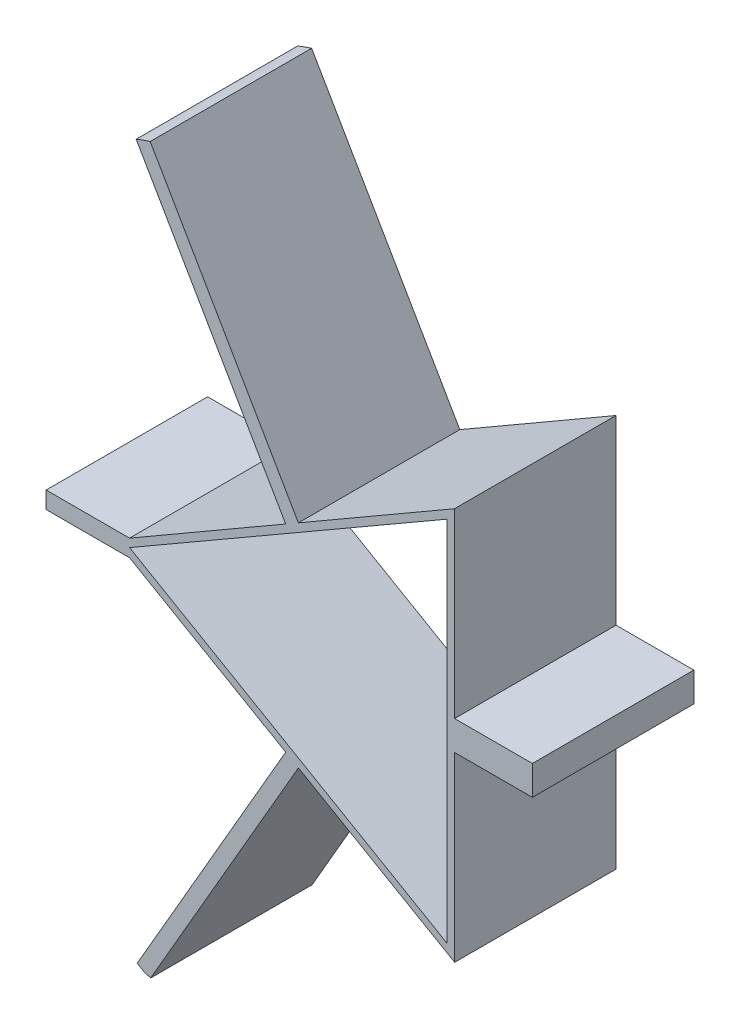
ISO-10303-21;
HEADER;
FILE_DESCRIPTION(('STEP AP214'),'2;1');
FILE_NAME('part.step','',(''),(''),'','','');
FILE_SCHEMA(('AUTOMOTIVE_DESIGN { 1 0 10303 214 1 1 1 1 }'));
ENDSEC;
DATA;
#1=APPLICATION_CONTEXT('core data for automotive mechanical design processes');
#2=APPLICATION_PROTOCOL_DEFINITION('international standard','automotive_design',2000,#1);
#3=PRODUCT_CONTEXT('',#1,'mechanical');
#4=PRODUCT('Part','Part','',(#3));
#5=PRODUCT_RELATED_PRODUCT_CATEGORY('part','',(#4));
#6=PRODUCT_DEFINITION_FORMATION('','',#4);
#7=PRODUCT_DEFINITION_CONTEXT('part definition',#1,'design');
#8=PRODUCT_DEFINITION('design','',#6,#7);
#9=PRODUCT_DEFINITION_SHAPE('','',#8);
#10=(LENGTH_UNIT() NAMED_UNIT(*) SI_UNIT(.MILLI.,.METRE.));
#11=(NAMED_UNIT(*) PLANE_ANGLE_UNIT() SI_UNIT($,.RADIAN.));
#12=(NAMED_UNIT(*) SI_UNIT($,.STERADIAN.) SOLID_ANGLE_UNIT());
#13=UNCERTAINTY_MEASURE_WITH_UNIT(LENGTH_MEASURE(1.E-05),#10,'distance_accuracy_value','');
#14=(GEOMETRIC_REPRESENTATION_CONTEXT(3) GLOBAL_UNCERTAINTY_ASSIGNED_CONTEXT((#13)) GLOBAL_UNIT_ASSIGNED_CONTEXT((#10,
#11,#12)) REPRESENTATION_CONTEXT('',''));
#15=CARTESIAN_POINT('',(0.,0.,0.));
#16=DIRECTION('',(0.,0.,1.));
#17=DIRECTION('',(1.,0.,0.));
#18=AXIS2_PLACEMENT_3D('',#15,#16,#17);
#19=CARTESIAN_POINT('',(-29.3482719637774,-0.0302829097671778,-8.));
#20=DIRECTION('',(-0.999999931482077,-0.00037018352380905,0.));
#21=DIRECTION('',(0.00037018352380905,-0.999999931482077,0.));
#22=AXIS2_PLACEMENT_3D('',#19,#20,#21);
#23=PLANE('',#22);
#24=DIRECTION('',(-3.26748433690366E-07,0.000882666002906134,-0.999999610450234));
#25=VECTOR('',#24,1.);
#26=CARTESIAN_POINT('',(-29.3475351909639,-2.02057344291709,3.));
#27=LINE('',#26,#25);
#28=CARTESIAN_POINT('',(-29.3475315967297,-2.03028277273133,14.));
#29=VERTEX_POINT('',#28);
#30=CARTESIAN_POINT('',(-29.3475387851981,-2.01086411310286,-8.));
#31=VERTEX_POINT('',#30);
#32=EDGE_CURVE('E201',#29,#31,#27,.T.);
#33=ORIENTED_EDGE('',*,*,#32,.F.);
#34=DIRECTION('',(0.00037018352380905,-0.999999931482077,0.));
#35=VECTOR('',#34,1.);
#36=CARTESIAN_POINT('',(-29.3482719637774,-0.0302829097671778,14.));
#37=LINE('',#36,#35);
#38=CARTESIAN_POINT('',(-29.3383657599753,-26.7905315059456,14.));
#39=VERTEX_POINT('',#38);
#40=EDGE_CURVE('E308',#29,#39,#37,.T.);
#41=ORIENTED_EDGE('',*,*,#40,.T.);
#42=DIRECTION('',(0.,0.,1.));
#43=VECTOR('',#42,1.);
#44=CARTESIAN_POINT('',(-29.3383657599753,-26.7905315059456,-8.));
#45=LINE('',#44,#43);
#46=CARTESIAN_POINT('',(-29.3383657599753,-26.7905315059456,-8.));
#47=VERTEX_POINT('',#46);
#48=EDGE_CURVE('E399',#47,#39,#45,.T.);
#49=ORIENTED_EDGE('',*,*,#48,.F.);
#50=DIRECTION('',(0.00037018352380905,-0.999999931482077,0.));
#51=VECTOR('',#50,1.);
#52=CARTESIAN_POINT('',(-29.3482719637774,-0.0302829097671778,-8.));
#53=LINE('',#52,#51);
#54=EDGE_CURVE('E34',#31,#47,#53,.T.);
#55=ORIENTED_EDGE('',*,*,#54,.F.);
#56=EDGE_LOOP('',(#33,#41,#49,#55));
#57=FACE_BOUND('',#56,.T.);
#58=ADVANCED_FACE('F17',(#57),#23,.F.);
#59=DIRECTION('',(3.26748433690358E-07,-0.000882666002906114,0.999999610450234));
#60=VECTOR('',#59,1.);
#61=CARTESIAN_POINT('',(-29.3490159250591,1.97942628301122,3.));
#62=LINE('',#61,#60);
#63=CARTESIAN_POINT('',(-29.3490195192934,1.98913561282545,-8.));
#64=VERTEX_POINT('',#63);
#65=CARTESIAN_POINT('',(-29.349012330825,1.96971695319698,14.));
#66=VERTEX_POINT('',#65);
#67=EDGE_CURVE('E42',#64,#66,#62,.T.);
#68=ORIENTED_EDGE('',*,*,#67,.F.);
#69=CARTESIAN_POINT('',(-29.3581781675795,26.7299656864112,-8.));
#70=VERTEX_POINT('',#69);
#71=EDGE_CURVE('E182',#70,#64,#53,.T.);
#72=ORIENTED_EDGE('',*,*,#71,.F.);
#73=DIRECTION('',(0.,0.,1.));
#74=VECTOR('',#73,1.);
#75=CARTESIAN_POINT('',(-29.3581781675795,26.7299656864112,-8.));
#76=LINE('',#75,#74);
#77=CARTESIAN_POINT('',(-29.3581781675795,26.7299656864112,14.));
#78=VERTEX_POINT('',#77);
#79=EDGE_CURVE('E397',#70,#78,#76,.T.);
#80=ORIENTED_EDGE('',*,*,#79,.T.);
#81=EDGE_CURVE('E309',#78,#66,#37,.T.);
#82=ORIENTED_EDGE('',*,*,#81,.T.);
#83=EDGE_LOOP('',(#68,#72,#80,#82));
#84=FACE_BOUND('',#83,.T.);
#85=ADVANCED_FACE('F428',(#84),#23,.F.);
#86=CARTESIAN_POINT('',(-52.0000941293348,-12.5350271048427,-8.));
#87=DIRECTION('',(0.50123354125477,0.865312046097362,0.));
#88=DIRECTION('',(-0.865312046097362,0.50123354125477,0.));
#89=AXIS2_PLACEMENT_3D('',#86,#87,#88);
#90=PLANE('',#89);
#91=DIRECTION('',(-0.865312046097362,0.50123354125477,0.));
#92=VECTOR('',#91,1.);
#93=CARTESIAN_POINT('',(-52.0000941293348,-12.5350271048427,14.));
#94=LINE('',#93,#92);
#95=CARTESIAN_POINT('',(-30.3590941875755,-25.0706147995064,14.));
#96=VERTEX_POINT('',#95);
#97=CARTESIAN_POINT('',(-73.6410940710941,0.000560589820879181,14.));
#98=VERTEX_POINT('',#97);
#99=EDGE_CURVE('E356',#96,#98,#94,.T.);
#100=ORIENTED_EDGE('',*,*,#99,.F.);
#101=DIRECTION('',(0.,0.,1.));
#102=VECTOR('',#101,1.);
#103=CARTESIAN_POINT('',(-30.3590941875755,-25.0706147995064,-8.));
#104=LINE('',#103,#102);
#105=CARTESIAN_POINT('',(-30.3590941875755,-25.0706147995064,-8.));
#106=VERTEX_POINT('',#105);
#107=EDGE_CURVE('E371',#106,#96,#104,.T.);
#108=ORIENTED_EDGE('',*,*,#107,.F.);
#109=DIRECTION('',(-0.865312046097362,0.50123354125477,0.));
#110=VECTOR('',#109,1.);
#111=CARTESIAN_POINT('',(-52.0000941293348,-12.5350271048427,-8.));
#112=LINE('',#111,#110);
#113=CARTESIAN_POINT('',(-73.6410940710941,0.000560589820879181,-8.));
#114=VERTEX_POINT('',#113);
#115=EDGE_CURVE('E280',#106,#114,#112,.T.);
#116=ORIENTED_EDGE('',*,*,#115,.T.);
#117=DIRECTION('',(0.,0.,1.));
#118=VECTOR('',#117,1.);
#119=CARTESIAN_POINT('',(-73.6410940710941,0.000560589820879181,-8.));
#120=LINE('',#119,#118);
#121=EDGE_CURVE('E11',#114,#98,#120,.T.);
#122=ORIENTED_EDGE('',*,*,#121,.T.);
#123=EDGE_LOOP('',(#100,#108,#116,#122));
#124=FACE_BOUND('',#123,.T.);
#125=ADVANCED_FACE('F434',(#124),#90,.T.);
#126=CARTESIAN_POINT('',(-51.9991770652761,12.498972861517,-8.));
#127=DIRECTION('',(-0.500103400825378,0.865965697059007,0.));
#128=DIRECTION('',(-0.865965697059007,-0.500103400825378,0.));
#129=AXIS2_PLACEMENT_3D('',#126,#127,#128);
#130=PLANE('',#129);
#131=DIRECTION('',(-0.865965697059007,-0.500103400825378,0.));
#132=VECTOR('',#131,1.);
#133=CARTESIAN_POINT('',(-51.9991770652761,12.498972861517,14.));
#134=LINE('',#133,#132);
#135=CARTESIAN_POINT('',(-30.357260059458,24.9973851332131,14.));
#136=VERTEX_POINT('',#135);
#137=EDGE_CURVE('E360',#136,#98,#134,.T.);
#138=ORIENTED_EDGE('',*,*,#137,.T.);
#139=ORIENTED_EDGE('',*,*,#121,.F.);
#140=DIRECTION('',(-0.865965697059007,-0.500103400825378,0.));
#141=VECTOR('',#140,1.);
#142=CARTESIAN_POINT('',(-51.9991770652761,12.498972861517,-8.));
#143=LINE('',#142,#141);
#144=CARTESIAN_POINT('',(-30.357260059458,24.9973851332131,-8.));
#145=VERTEX_POINT('',#144);
#146=EDGE_CURVE('E284',#145,#114,#143,.T.);
#147=ORIENTED_EDGE('',*,*,#146,.F.);
#148=DIRECTION('',(0.,0.,1.));
#149=VECTOR('',#148,1.);
#150=CARTESIAN_POINT('',(-30.357260059458,24.9973851332131,-8.));
#151=LINE('',#150,#149);
#152=EDGE_CURVE('E26',#145,#136,#151,.T.);
#153=ORIENTED_EDGE('',*,*,#152,.T.);
#154=EDGE_LOOP('',(#138,#139,#147,#153));
#155=FACE_BOUND('',#154,.T.);
#156=ADVANCED_FACE('F448',(#155),#130,.F.);
#157=CARTESIAN_POINT('',(-30.3581771235168,12.4973851668534,-8.));
#158=DIRECTION('',(0.999999997308779,-7.33651246993816E-05,0.));
#159=DIRECTION('',(7.33651246993816E-05,0.999999997308779,0.));
#160=AXIS2_PLACEMENT_3D('',#157,#158,#159);
#161=PLANE('',#160);
#162=DIRECTION('',(7.33651246993816E-05,0.999999997308779,0.));
#163=VECTOR('',#162,1.);
#164=CARTESIAN_POINT('',(-30.3581771235168,12.4973851668534,14.));
#165=LINE('',#164,#163);
#166=CARTESIAN_POINT('',(-30.3590941875755,-0.00261479950636377,14.));
#167=VERTEX_POINT('',#166);
#168=EDGE_CURVE('E364',#167,#136,#165,.T.);
#169=ORIENTED_EDGE('',*,*,#168,.T.);
#170=ORIENTED_EDGE('',*,*,#152,.F.);
#171=DIRECTION('',(7.33651246993816E-05,0.999999997308779,0.));
#172=VECTOR('',#171,1.);
#173=CARTESIAN_POINT('',(-30.3581771235168,12.4973851668534,-8.));
#174=LINE('',#173,#172);
#175=CARTESIAN_POINT('',(-30.3590941875755,-0.00261479950636377,-8.));
#176=VERTEX_POINT('',#175);
#177=EDGE_CURVE('E288',#176,#145,#174,.T.);
#178=ORIENTED_EDGE('',*,*,#177,.F.);
#179=DIRECTION('',(0.,0.,1.));
#180=VECTOR('',#179,1.);
#181=CARTESIAN_POINT('',(-30.3590941875755,-0.00261479950636377,-8.));
#182=LINE('',#181,#180);
#183=EDGE_CURVE('E373',#176,#167,#182,.T.);
#184=ORIENTED_EDGE('',*,*,#183,.T.);
#185=EDGE_LOOP('',(#169,#170,#178,#184));
#186=FACE_BOUND('',#185,.T.);
#187=ADVANCED_FACE('F444',(#186),#161,.F.);
#188=CARTESIAN_POINT('',(-65.,-30.2,-8.));
#189=DIRECTION('',(0.,0.,1.));
#190=DIRECTION('',(1.,0.,0.));
#191=AXIS2_PLACEMENT_3D('',#188,#189,#190);
#192=CYLINDRICAL_SURFACE('',#191,20.);
#193=CARTESIAN_POINT('',(-65.,-30.2,14.));
#194=DIRECTION('',(0.,0.,-1.));
#195=DIRECTION('',(1.,0.,0.));
#196=AXIS2_PLACEMENT_3D('',#193,#194,#195);
#197=CIRCLE('',#196,20.);
#198=CARTESIAN_POINT('',(-70.7625344076639,-49.3518457909542,14.));
#199=VERTEX_POINT('',#198);
#200=CARTESIAN_POINT('',(-71.7329872993471,-49.0326015735169,14.));
#201=VERTEX_POINT('',#200);
#202=EDGE_CURVE('E184',#199,#201,#197,.T.);
#203=ORIENTED_EDGE('',*,*,#202,.T.);
#204=DIRECTION('',(0.,0.,1.));
#205=VECTOR('',#204,1.);
#206=CARTESIAN_POINT('',(-71.7329872993471,-49.0326015735169,-8.));
#207=LINE('',#206,#205);
#208=CARTESIAN_POINT('',(-71.7329872993471,-49.0326015735169,-8.));
#209=VERTEX_POINT('',#208);
#210=EDGE_CURVE('E296',#209,#201,#207,.T.);
#211=ORIENTED_EDGE('',*,*,#210,.F.);
#212=CARTESIAN_POINT('',(-65.,-30.2,-8.));
#213=DIRECTION('',(0.,0.,-1.));
#214=DIRECTION('',(1.,0.,0.));
#215=AXIS2_PLACEMENT_3D('',#212,#213,#214);
#216=CIRCLE('',#215,20.);
#217=CARTESIAN_POINT('',(-70.7625344076639,-49.3518457909542,-8.));
#218=VERTEX_POINT('',#217);
#219=EDGE_CURVE('E222',#218,#209,#216,.T.);
#220=ORIENTED_EDGE('',*,*,#219,.F.);
#221=DIRECTION('',(0.,0.,1.));
#222=VECTOR('',#221,1.);
#223=CARTESIAN_POINT('',(-70.7625344076639,-49.3518457909542,-8.));
#224=LINE('',#223,#222);
#225=EDGE_CURVE('E21',#218,#199,#224,.T.);
#226=ORIENTED_EDGE('',*,*,#225,.T.);
#227=EDGE_LOOP('',(#203,#211,#220,#226));
#228=FACE_BOUND('',#227,.T.);
#229=ADVANCED_FACE('F19',(#228),#192,.T.);
#230=CARTESIAN_POINT('',(-60.7454743769544,-32.0130937148719,-8.));
#231=DIRECTION('',(-0.865884230486479,0.5002444396441,0.));
#232=DIRECTION('',(-0.5002444396441,-0.865884230486479,0.));
#233=AXIS2_PLACEMENT_3D('',#230,#231,#232);
#234=PLANE('',#233);
#235=DIRECTION('',(-0.5002444396441,-0.865884230486478,0.));
#236=VECTOR('',#235,1.);
#237=CARTESIAN_POINT('',(-60.7454743769544,-32.0130937148719,14.));
#238=LINE('',#237,#236);
#239=CARTESIAN_POINT('',(-50.6238456850482,-14.4933414165828,14.));
#240=VERTEX_POINT('',#239);
#241=EDGE_CURVE('E300',#240,#199,#238,.T.);
#242=ORIENTED_EDGE('',*,*,#241,.T.);
#243=ORIENTED_EDGE('',*,*,#225,.F.);
#244=DIRECTION('',(-0.5002444396441,-0.865884230486478,0.));
#245=VECTOR('',#244,1.);
#246=CARTESIAN_POINT('',(-60.7454743769544,-32.0130937148719,-8.));
#247=LINE('',#246,#245);
#248=CARTESIAN_POINT('',(-50.6238456850482,-14.4933414165828,-8.));
#249=VERTEX_POINT('',#248);
#250=EDGE_CURVE('E225',#249,#218,#247,.T.);
#251=ORIENTED_EDGE('',*,*,#250,.F.);
#252=DIRECTION('',(0.,0.,1.));
#253=VECTOR('',#252,1.);
#254=CARTESIAN_POINT('',(-50.6238456850482,-14.4933414165828,-8.));
#255=LINE('',#254,#253);
#256=EDGE_CURVE('E401',#249,#240,#255,.T.);
#257=ORIENTED_EDGE('',*,*,#256,.T.);
#258=EDGE_LOOP('',(#242,#243,#251,#257));
#259=FACE_BOUND('',#258,.T.);
#260=ADVANCED_FACE('F409',(#259),#234,.F.);
#261=CARTESIAN_POINT('',(-39.9811057225117,-20.6419364612642,-8.));
#262=DIRECTION('',(-0.5002444396441,-0.865884230486479,0.));
#263=DIRECTION('',(0.865884230486479,-0.5002444396441,0.));
#264=AXIS2_PLACEMENT_3D('',#261,#262,#263);
#265=PLANE('',#264);
#266=DIRECTION('',(0.865884230486478,-0.5002444396441,0.));
#267=VECTOR('',#266,1.);
#268=CARTESIAN_POINT('',(-39.9811057225117,-20.6419364612642,14.));
#269=LINE('',#268,#267);
#270=EDGE_CURVE('E304',#240,#39,#269,.T.);
#271=ORIENTED_EDGE('',*,*,#270,.F.);
#272=ORIENTED_EDGE('',*,*,#256,.F.);
#273=DIRECTION('',(0.865884230486478,-0.5002444396441,0.));
#274=VECTOR('',#273,1.);
#275=CARTESIAN_POINT('',(-39.9811057225117,-20.6419364612642,-8.));
#276=LINE('',#275,#274);
#277=EDGE_CURVE('E230',#249,#47,#276,.T.);
#278=ORIENTED_EDGE('',*,*,#277,.T.);
#279=ORIENTED_EDGE('',*,*,#48,.T.);
#280=EDGE_LOOP('',(#271,#272,#278,#279));
#281=FACE_BOUND('',#280,.T.);
#282=ADVANCED_FACE('F421',(#281),#265,.T.);
#283=CARTESIAN_POINT('',(-39.9960938332481,20.5768522114181,-8.));
#284=DIRECTION('',(-0.500690077813435,0.865626620419669,0.));
#285=DIRECTION('',(-0.865626620419669,-0.500690077813435,0.));
#286=AXIS2_PLACEMENT_3D('',#283,#284,#285);
#287=PLANE('',#286);
#288=DIRECTION('',(-0.865626620419669,-0.500690077813435,0.));
#289=VECTOR('',#288,1.);
#290=CARTESIAN_POINT('',(-39.9960938332481,20.5768522114181,14.));
#291=LINE('',#290,#289);
#292=CARTESIAN_POINT('',(-50.6340094989171,14.4237387364256,14.));
#293=VERTEX_POINT('',#292);
#294=EDGE_CURVE('E312',#78,#293,#291,.T.);
#295=ORIENTED_EDGE('',*,*,#294,.F.);
#296=ORIENTED_EDGE('',*,*,#79,.F.);
#297=DIRECTION('',(-0.865626620419669,-0.500690077813435,0.));
#298=VECTOR('',#297,1.);
#299=CARTESIAN_POINT('',(-39.9960938332481,20.5768522114181,-8.));
#300=LINE('',#299,#298);
#301=CARTESIAN_POINT('',(-50.6340094989171,14.4237387364256,-8.));
#302=VERTEX_POINT('',#301);
#303=EDGE_CURVE('E236',#70,#302,#300,.T.);
#304=ORIENTED_EDGE('',*,*,#303,.T.);
#305=DIRECTION('',(0.,0.,1.));
#306=VECTOR('',#305,1.);
#307=CARTESIAN_POINT('',(-50.6340094989171,14.4237387364256,-8.));
#308=LINE('',#307,#306);
#309=EDGE_CURVE('E395',#302,#293,#308,.T.);
#310=ORIENTED_EDGE('',*,*,#309,.T.);
#311=EDGE_LOOP('',(#295,#296,#304,#310));
#312=FACE_BOUND('',#311,.T.);
#313=ADVANCED_FACE('F437',(#312),#287,.T.);
#314=CARTESIAN_POINT('',(-60.7299131635778,31.8782147817421,-8.));
#315=DIRECTION('',(0.865626620419655,0.500690077813458,0.));
#316=DIRECTION('',(-0.500690077813458,0.865626620419655,0.));
#317=AXIS2_PLACEMENT_3D('',#314,#315,#316);
#318=PLANE('',#317);
#319=DIRECTION('',(-0.500690077813458,0.865626620419655,0.));
#320=VECTOR('',#319,1.);
#321=CARTESIAN_POINT('',(-60.7299131635778,31.8782147817421,14.));
#322=LINE('',#321,#320);
#323=CARTESIAN_POINT('',(-70.8258168282385,49.3326908270586,14.));
#324=VERTEX_POINT('',#323);
#325=EDGE_CURVE('E316',#293,#324,#322,.T.);
#326=ORIENTED_EDGE('',*,*,#325,.F.);
#327=ORIENTED_EDGE('',*,*,#309,.F.);
#328=DIRECTION('',(-0.500690077813458,0.865626620419655,0.));
#329=VECTOR('',#328,1.);
#330=CARTESIAN_POINT('',(-60.7299131635778,31.8782147817421,-8.));
#331=LINE('',#330,#329);
#332=CARTESIAN_POINT('',(-70.8258168282385,49.3326908270586,-8.));
#333=VERTEX_POINT('',#332);
#334=EDGE_CURVE('E240',#302,#333,#331,.T.);
#335=ORIENTED_EDGE('',*,*,#334,.T.);
#336=DIRECTION('',(0.,0.,1.));
#337=VECTOR('',#336,1.);
#338=CARTESIAN_POINT('',(-70.8258168282385,49.3326908270586,-8.));
#339=LINE('',#338,#337);
#340=EDGE_CURVE('E393',#333,#324,#339,.T.);
#341=ORIENTED_EDGE('',*,*,#340,.T.);
#342=EDGE_LOOP('',(#326,#327,#335,#341));
#343=FACE_BOUND('',#342,.T.);
#344=ADVANCED_FACE('F495',(#343),#318,.T.);
#345=CARTESIAN_POINT('',(-65.,30.2,-8.));
#346=DIRECTION('',(0.,0.,1.));
#347=DIRECTION('',(1.,0.,0.));
#348=AXIS2_PLACEMENT_3D('',#345,#346,#347);
#349=CYLINDRICAL_SURFACE('',#348,20.);
#350=CARTESIAN_POINT('',(-65.,30.2,14.));
#351=DIRECTION('',(0.,0.,-1.));
#352=DIRECTION('',(1.,0.,0.));
#353=AXIS2_PLACEMENT_3D('',#350,#351,#352);
#354=CIRCLE('',#353,20.);
#355=CARTESIAN_POINT('',(-72.7372176046347,48.6427618251316,14.));
#356=VERTEX_POINT('',#355);
#357=EDGE_CURVE('E320',#356,#324,#354,.T.);
#358=ORIENTED_EDGE('',*,*,#357,.T.);
#359=ORIENTED_EDGE('',*,*,#340,.F.);
#360=CARTESIAN_POINT('',(-65.,30.2,-8.));
#361=DIRECTION('',(0.,0.,-1.));
#362=DIRECTION('',(1.,0.,0.));
#363=AXIS2_PLACEMENT_3D('',#360,#361,#362);
#364=CIRCLE('',#363,20.);
#365=CARTESIAN_POINT('',(-72.7372176046347,48.6427618251316,-8.));
#366=VERTEX_POINT('',#365);
#367=EDGE_CURVE('E244',#366,#333,#364,.T.);
#368=ORIENTED_EDGE('',*,*,#367,.F.);
#369=DIRECTION('',(0.,0.,1.));
#370=VECTOR('',#369,1.);
#371=CARTESIAN_POINT('',(-72.7372176046347,48.6427618251316,-8.));
#372=LINE('',#371,#370);
#373=EDGE_CURVE('E391',#366,#356,#372,.T.);
#374=ORIENTED_EDGE('',*,*,#373,.T.);
#375=EDGE_LOOP('',(#358,#359,#368,#374));
#376=FACE_BOUND('',#375,.T.);
#377=ADVANCED_FACE('F492',(#376),#349,.T.);
#378=CARTESIAN_POINT('',(-62.5512401721955,31.0325602029652,-8.));
#379=DIRECTION('',(0.865626620419656,0.500690077813456,0.));
#380=DIRECTION('',(-0.500690077813456,0.865626620419656,0.));
#381=AXIS2_PLACEMENT_3D('',#378,#379,#380);
#382=PLANE('',#381);
#383=DIRECTION('',(-0.500690077813456,0.865626620419656,0.));
#384=VECTOR('',#383,1.);
#385=CARTESIAN_POINT('',(-62.5512401721955,31.0325602029652,14.));
#386=LINE('',#385,#384);
#387=CARTESIAN_POINT('',(-52.3652627397564,13.4223585807987,14.));
#388=VERTEX_POINT('',#387);
#389=EDGE_CURVE('E324',#388,#356,#386,.T.);
#390=ORIENTED_EDGE('',*,*,#389,.T.);
#391=ORIENTED_EDGE('',*,*,#373,.F.);
#392=DIRECTION('',(-0.500690077813456,0.865626620419656,0.));
#393=VECTOR('',#392,1.);
#394=CARTESIAN_POINT('',(-62.5512401721955,31.0325602029652,-8.));
#395=LINE('',#394,#393);
#396=CARTESIAN_POINT('',(-52.3652627397564,13.4223585807987,-8.));
#397=VERTEX_POINT('',#396);
#398=EDGE_CURVE('E248',#397,#366,#395,.T.);
#399=ORIENTED_EDGE('',*,*,#398,.F.);
#400=DIRECTION('',(0.,0.,1.));
#401=VECTOR('',#400,1.);
#402=CARTESIAN_POINT('',(-52.3652627397564,13.4223585807987,-8.));
#403=LINE('',#402,#401);
#404=EDGE_CURVE('E389',#397,#388,#403,.T.);
#405=ORIENTED_EDGE('',*,*,#404,.T.);
#406=EDGE_LOOP('',(#390,#391,#399,#405));
#407=FACE_BOUND('',#406,.T.);
#408=ADVANCED_FACE('F488',(#407),#382,.F.);
#409=CARTESIAN_POINT('',(-63.0031784054254,7.26924510580614,-8.));
#410=DIRECTION('',(-0.500690077813434,0.865626620419669,0.));
#411=DIRECTION('',(-0.865626620419669,-0.500690077813434,0.));
#412=AXIS2_PLACEMENT_3D('',#409,#410,#411);
#413=PLANE('',#412);
#414=DIRECTION('',(-0.865626620419669,-0.500690077813434,0.));
#415=VECTOR('',#414,1.);
#416=CARTESIAN_POINT('',(-63.0031784054254,7.26924510580614,14.));
#417=LINE('',#416,#415);
#418=CARTESIAN_POINT('',(-73.6410940710941,1.11613163081308,14.));
#419=VERTEX_POINT('',#418);
#420=EDGE_CURVE('E328',#388,#419,#417,.T.);
#421=ORIENTED_EDGE('',*,*,#420,.F.);
#422=ORIENTED_EDGE('',*,*,#404,.F.);
#423=DIRECTION('',(-0.865626620419669,-0.500690077813434,0.));
#424=VECTOR('',#423,1.);
#425=CARTESIAN_POINT('',(-63.0031784054254,7.26924510580614,-8.));
#426=LINE('',#425,#424);
#427=CARTESIAN_POINT('',(-73.6410940710941,1.11613163081308,-8.));
#428=VERTEX_POINT('',#427);
#429=EDGE_CURVE('E252',#397,#428,#426,.T.);
#430=ORIENTED_EDGE('',*,*,#429,.T.);
#431=DIRECTION('',(0.,0.,1.));
#432=VECTOR('',#431,1.);
#433=CARTESIAN_POINT('',(-73.6410940710941,1.11613163081308,-8.));
#434=LINE('',#433,#432);
#435=EDGE_CURVE('E387',#428,#419,#434,.T.);
#436=ORIENTED_EDGE('',*,*,#435,.T.);
#437=EDGE_LOOP('',(#421,#422,#430,#436));
#438=FACE_BOUND('',#437,.T.);
#439=ADVANCED_FACE('F484',(#438),#413,.T.);
#440=CARTESIAN_POINT('',(-79.3205470355471,1.11613163081308,-8.));
#441=DIRECTION('',(0.,1.,0.));
#442=DIRECTION('',(0.,0.,1.));
#443=AXIS2_PLACEMENT_3D('',#440,#441,#442);
#444=PLANE('',#443);
#445=DIRECTION('',(-1.,0.,0.));
#446=VECTOR('',#445,1.);
#447=CARTESIAN_POINT('',(-79.3205470355471,1.11613163081308,14.));
#448=LINE('',#447,#446);
#449=CARTESIAN_POINT('',(-85.,1.11613163081308,14.));
#450=VERTEX_POINT('',#449);
#451=EDGE_CURVE('E332',#419,#450,#448,.T.);
#452=ORIENTED_EDGE('',*,*,#451,.F.);
#453=ORIENTED_EDGE('',*,*,#435,.F.);
#454=DIRECTION('',(-1.,0.,0.));
#455=VECTOR('',#454,1.);
#456=CARTESIAN_POINT('',(-79.3205470355471,1.11613163081308,-8.));
#457=LINE('',#456,#455);
#458=CARTESIAN_POINT('',(-85.,1.11613163081308,-8.));
#459=VERTEX_POINT('',#458);
#460=EDGE_CURVE('E256',#428,#459,#457,.T.);
#461=ORIENTED_EDGE('',*,*,#460,.T.);
#462=DIRECTION('',(0.,0.,1.));
#463=VECTOR('',#462,1.);
#464=CARTESIAN_POINT('',(-85.,1.11613163081308,-8.));
#465=LINE('',#464,#463);
#466=EDGE_CURVE('E385',#459,#450,#465,.T.);
#467=ORIENTED_EDGE('',*,*,#466,.T.);
#468=EDGE_LOOP('',(#452,#453,#461,#467));
#469=FACE_BOUND('',#468,.T.);
#470=ADVANCED_FACE('F480',(#469),#444,.T.);
#471=CARTESIAN_POINT('',(-85.,0.,-8.));
#472=DIRECTION('',(-1.,0.,0.));
#473=DIRECTION('',(0.,0.,1.));
#474=AXIS2_PLACEMENT_3D('',#471,#472,#473);
#475=PLANE('',#474);
#476=DIRECTION('',(0.,-1.,0.));
#477=VECTOR('',#476,1.);
#478=CARTESIAN_POINT('',(-85.,0.,14.));
#479=LINE('',#478,#477);
#480=CARTESIAN_POINT('',(-85.,-1.19566244793186,14.));
#481=VERTEX_POINT('',#480);
#482=EDGE_CURVE('E336',#450,#481,#479,.T.);
#483=ORIENTED_EDGE('',*,*,#482,.F.);
#484=ORIENTED_EDGE('',*,*,#466,.F.);
#485=DIRECTION('',(0.,-1.,0.));
#486=VECTOR('',#485,1.);
#487=CARTESIAN_POINT('',(-85.,0.,-8.));
#488=LINE('',#487,#486);
#489=CARTESIAN_POINT('',(-85.,-1.19566244793186,-8.));
#490=VERTEX_POINT('',#489);
#491=EDGE_CURVE('E260',#459,#490,#488,.T.);
#492=ORIENTED_EDGE('',*,*,#491,.T.);
#493=DIRECTION('',(0.,0.,1.));
#494=VECTOR('',#493,1.);
#495=CARTESIAN_POINT('',(-85.,-1.19566244793186,-8.));
#496=LINE('',#495,#494);
#497=EDGE_CURVE('E383',#490,#481,#496,.T.);
#498=ORIENTED_EDGE('',*,*,#497,.T.);
#499=EDGE_LOOP('',(#483,#484,#492,#498));
#500=FACE_BOUND('',#499,.T.);
#501=ADVANCED_FACE('F476',(#500),#475,.T.);
#502=CARTESIAN_POINT('',(-79.3205470355471,-1.19566244793186,-8.));
#503=DIRECTION('',(0.,1.,0.));
#504=DIRECTION('',(0.,0.,1.));
#505=AXIS2_PLACEMENT_3D('',#502,#503,#504);
#506=PLANE('',#505);
#507=DIRECTION('',(-1.,0.,0.));
#508=VECTOR('',#507,1.);
#509=CARTESIAN_POINT('',(-79.3205470355471,-1.19566244793186,14.));
#510=LINE('',#509,#508);
#511=CARTESIAN_POINT('',(-73.6410940710941,-1.19566244793186,14.));
#512=VERTEX_POINT('',#511);
#513=EDGE_CURVE('E340',#512,#481,#510,.T.);
#514=ORIENTED_EDGE('',*,*,#513,.T.);
#515=ORIENTED_EDGE('',*,*,#497,.F.);
#516=DIRECTION('',(-1.,0.,0.));
#517=VECTOR('',#516,1.);
#518=CARTESIAN_POINT('',(-79.3205470355471,-1.19566244793186,-8.));
#519=LINE('',#518,#517);
#520=CARTESIAN_POINT('',(-73.6410940710941,-1.19566244793186,-8.));
#521=VERTEX_POINT('',#520);
#522=EDGE_CURVE('E264',#521,#490,#519,.T.);
#523=ORIENTED_EDGE('',*,*,#522,.F.);
#524=DIRECTION('',(0.,0.,1.));
#525=VECTOR('',#524,1.);
#526=CARTESIAN_POINT('',(-73.6410940710941,-1.19566244793186,-8.));
#527=LINE('',#526,#525);
#528=EDGE_CURVE('E381',#521,#512,#527,.T.);
#529=ORIENTED_EDGE('',*,*,#528,.T.);
#530=EDGE_LOOP('',(#514,#515,#523,#529));
#531=FACE_BOUND('',#530,.T.);
#532=ADVANCED_FACE('F472',(#531),#506,.F.);
#533=CARTESIAN_POINT('',(-62.9983541085576,-7.34425749261324,-8.));
#534=DIRECTION('',(-0.5002444396441,-0.865884230486478,0.));
#535=DIRECTION('',(0.865884230486478,-0.5002444396441,0.));
#536=AXIS2_PLACEMENT_3D('',#533,#534,#535);
#537=PLANE('',#536);
#538=DIRECTION('',(0.865884230486478,-0.5002444396441,0.));
#539=VECTOR('',#538,1.);
#540=CARTESIAN_POINT('',(-62.9983541085576,-7.34425749261324,14.));
#541=LINE('',#540,#539);
#542=CARTESIAN_POINT('',(-52.3556141460212,-13.4928525372946,14.));
#543=VERTEX_POINT('',#542);
#544=EDGE_CURVE('E344',#512,#543,#541,.T.);
#545=ORIENTED_EDGE('',*,*,#544,.F.);
#546=ORIENTED_EDGE('',*,*,#528,.F.);
#547=DIRECTION('',(0.865884230486478,-0.5002444396441,0.));
#548=VECTOR('',#547,1.);
#549=CARTESIAN_POINT('',(-62.9983541085576,-7.34425749261324,-8.));
#550=LINE('',#549,#548);
#551=CARTESIAN_POINT('',(-52.3556141460212,-13.4928525372946,-8.));
#552=VERTEX_POINT('',#551);
#553=EDGE_CURVE('E268',#521,#552,#550,.T.);
#554=ORIENTED_EDGE('',*,*,#553,.T.);
#555=DIRECTION('',(0.,0.,1.));
#556=VECTOR('',#555,1.);
#557=CARTESIAN_POINT('',(-52.3556141460212,-13.4928525372946,-8.));
#558=LINE('',#557,#556);
#559=EDGE_CURVE('E379',#552,#543,#558,.T.);
#560=ORIENTED_EDGE('',*,*,#559,.T.);
#561=EDGE_LOOP('',(#545,#546,#554,#560));
#562=FACE_BOUND('',#561,.T.);
#563=ADVANCED_FACE('F468',(#562),#537,.T.);
#564=CARTESIAN_POINT('',(-62.4772428379274,-31.0126048355837,-8.));
#565=DIRECTION('',(-0.865884230486479,0.5002444396441,0.));
#566=DIRECTION('',(-0.5002444396441,-0.865884230486479,0.));
#567=AXIS2_PLACEMENT_3D('',#564,#565,#566);
#568=PLANE('',#567);
#569=DIRECTION('',(-0.5002444396441,-0.865884230486478,0.));
#570=VECTOR('',#569,1.);
#571=CARTESIAN_POINT('',(-62.4772428379274,-31.0126048355837,14.));
#572=LINE('',#571,#570);
#573=CARTESIAN_POINT('',(-72.5988715298336,-48.5323571338728,14.));
#574=VERTEX_POINT('',#573);
#575=EDGE_CURVE('E348',#543,#574,#572,.T.);
#576=ORIENTED_EDGE('',*,*,#575,.F.);
#577=ORIENTED_EDGE('',*,*,#559,.F.);
#578=DIRECTION('',(-0.5002444396441,-0.865884230486478,0.));
#579=VECTOR('',#578,1.);
#580=CARTESIAN_POINT('',(-62.4772428379274,-31.0126048355837,-8.));
#581=LINE('',#580,#579);
#582=CARTESIAN_POINT('',(-72.5988715298336,-48.5323571338728,-8.));
#583=VERTEX_POINT('',#582);
#584=EDGE_CURVE('E272',#552,#583,#581,.T.);
#585=ORIENTED_EDGE('',*,*,#584,.T.);
#586=DIRECTION('',(0.,0.,1.));
#587=VECTOR('',#586,1.);
#588=CARTESIAN_POINT('',(-72.5988715298336,-48.5323571338728,-8.));
#589=LINE('',#588,#587);
#590=EDGE_CURVE('E377',#583,#574,#589,.T.);
#591=ORIENTED_EDGE('',*,*,#590,.T.);
#592=EDGE_LOOP('',(#576,#577,#585,#591));
#593=FACE_BOUND('',#592,.T.);
#594=ADVANCED_FACE('F465',(#593),#568,.T.);
#595=CARTESIAN_POINT('',(-71.7329872993471,-49.0326015735169,-8.));
#596=DIRECTION('',(0.500244439644101,0.865884230486478,0.));
#597=DIRECTION('',(-0.865884230486478,0.500244439644101,0.));
#598=AXIS2_PLACEMENT_3D('',#595,#596,#597);
#599=PLANE('',#598);
#600=DIRECTION('',(-0.865884230486478,0.500244439644101,0.));
#601=VECTOR('',#600,1.);
#602=CARTESIAN_POINT('',(-71.7329872993471,-49.0326015735169,14.));
#603=LINE('',#602,#601);
#604=EDGE_CURVE('E352',#201,#574,#603,.T.);
#605=ORIENTED_EDGE('',*,*,#604,.T.);
#606=ORIENTED_EDGE('',*,*,#590,.F.);
#607=DIRECTION('',(-0.865884230486478,0.500244439644101,0.));
#608=VECTOR('',#607,1.);
#609=CARTESIAN_POINT('',(-71.7329872993471,-49.0326015735169,-8.));
#610=LINE('',#609,#608);
#611=EDGE_CURVE('E276',#209,#583,#610,.T.);
#612=ORIENTED_EDGE('',*,*,#611,.F.);
#613=ORIENTED_EDGE('',*,*,#210,.T.);
#614=EDGE_LOOP('',(#605,#606,#612,#613));
#615=FACE_BOUND('',#614,.T.);
#616=ADVANCED_FACE('F416',(#615),#599,.F.);
#617=CARTESIAN_POINT('',(-30.3590941875755,-0.0194605938993054,-8.));
#618=DIRECTION('',(-1.,0.,0.));
#619=DIRECTION('',(0.,0.,1.));
#620=AXIS2_PLACEMENT_3D('',#617,#618,#619);
#621=PLANE('',#620);
#622=DIRECTION('',(0.,-1.,0.));
#623=VECTOR('',#622,1.);
#624=CARTESIAN_POINT('',(-30.3590941875755,-0.0194605938993054,14.));
#625=LINE('',#624,#623);
#626=EDGE_CURVE('E226',#167,#96,#625,.T.);
#627=ORIENTED_EDGE('',*,*,#626,.F.);
#628=ORIENTED_EDGE('',*,*,#183,.F.);
#629=DIRECTION('',(0.,-1.,0.));
#630=VECTOR('',#629,1.);
#631=CARTESIAN_POINT('',(-30.3590941875755,-0.0194605938993054,-8.));
#632=LINE('',#631,#630);
#633=EDGE_CURVE('E292',#176,#106,#632,.T.);
#634=ORIENTED_EDGE('',*,*,#633,.T.);
#635=ORIENTED_EDGE('',*,*,#107,.T.);
#636=EDGE_LOOP('',(#627,#628,#634,#635));
#637=FACE_BOUND('',#636,.T.);
#638=ADVANCED_FACE('F457',(#637),#621,.T.);
#639=CARTESIAN_POINT('',(0.,0.,-8.));
#640=DIRECTION('',(0.,0.,1.));
#641=DIRECTION('',(0.,-1.,0.));
#642=AXIS2_PLACEMENT_3D('',#639,#640,#641);
#643=PLANE('',#642);
#644=ORIENTED_EDGE('',*,*,#219,.T.);
#645=ORIENTED_EDGE('',*,*,#611,.T.);
#646=ORIENTED_EDGE('',*,*,#584,.F.);
#647=ORIENTED_EDGE('',*,*,#553,.F.);
#648=ORIENTED_EDGE('',*,*,#522,.T.);
#649=ORIENTED_EDGE('',*,*,#491,.F.);
#650=ORIENTED_EDGE('',*,*,#460,.F.);
#651=ORIENTED_EDGE('',*,*,#429,.F.);
#652=ORIENTED_EDGE('',*,*,#398,.T.);
#653=ORIENTED_EDGE('',*,*,#367,.T.);
#654=ORIENTED_EDGE('',*,*,#334,.F.);
#655=ORIENTED_EDGE('',*,*,#303,.F.);
#656=ORIENTED_EDGE('',*,*,#71,.T.);
#657=DIRECTION('',(-0.999999931482077,-0.00037018352380905,0.));
#658=VECTOR('',#657,1.);
#659=CARTESIAN_POINT('',(-18.7490202455833,1.99305955817783,-8.));
#660=LINE('',#659,#658);
#661=CARTESIAN_POINT('',(-18.7490202455833,1.99305955817783,-8.));
#662=VERTEX_POINT('',#661);
#663=EDGE_CURVE('E174',#662,#64,#660,.T.);
#664=ORIENTED_EDGE('',*,*,#663,.F.);
#665=DIRECTION('',(0.00037018352380905,-0.999999931482077,0.));
#666=VECTOR('',#665,1.);
#667=CARTESIAN_POINT('',(-18.7482726900673,-0.0263589644148019,-8.));
#668=LINE('',#667,#666);
#669=CARTESIAN_POINT('',(-18.7475395114881,-2.00694016775048,-8.));
#670=VERTEX_POINT('',#669);
#671=EDGE_CURVE('E180',#662,#670,#668,.T.);
#672=ORIENTED_EDGE('',*,*,#671,.T.);
#673=DIRECTION('',(-0.999999931482077,-0.00037018352380905,0.));
#674=VECTOR('',#673,1.);
#675=CARTESIAN_POINT('',(-18.7475395114881,-2.00694016775048,-8.));
#676=LINE('',#675,#674);
#677=EDGE_CURVE('E215',#670,#31,#676,.T.);
#678=ORIENTED_EDGE('',*,*,#677,.T.);
#679=ORIENTED_EDGE('',*,*,#54,.T.);
#680=ORIENTED_EDGE('',*,*,#277,.F.);
#681=ORIENTED_EDGE('',*,*,#250,.T.);
#682=EDGE_LOOP('',(#644,#645,#646,#647,#648,#649,#650,#651,#652,#653,#654,#655,#656,#664,#672,
#678,#679,#680,#681));
#683=FACE_BOUND('',#682,.T.);
#684=ORIENTED_EDGE('',*,*,#115,.F.);
#685=ORIENTED_EDGE('',*,*,#633,.F.);
#686=ORIENTED_EDGE('',*,*,#177,.T.);
#687=ORIENTED_EDGE('',*,*,#146,.T.);
#688=EDGE_LOOP('',(#684,#685,#686,#687));
#689=FACE_BOUND('',#688,.T.);
#690=ADVANCED_FACE('F177',(#683,#689),#643,.F.);
#691=CARTESIAN_POINT('',(0.,0.,14.));
#692=DIRECTION('',(0.,0.,1.));
#693=DIRECTION('',(0.,-1.,0.));
#694=AXIS2_PLACEMENT_3D('',#691,#692,#693);
#695=PLANE('',#694);
#696=ORIENTED_EDGE('',*,*,#202,.F.);
#697=ORIENTED_EDGE('',*,*,#241,.F.);
#698=ORIENTED_EDGE('',*,*,#270,.T.);
#699=ORIENTED_EDGE('',*,*,#40,.F.);
#700=DIRECTION('',(-0.999999931482077,-0.00037018352380905,0.));
#701=VECTOR('',#700,1.);
#702=CARTESIAN_POINT('',(-18.7475323230198,-2.02635882737896,14.));
#703=LINE('',#702,#701);
#704=CARTESIAN_POINT('',(-18.7475323230198,-2.02635882737896,14.));
#705=VERTEX_POINT('',#704);
#706=EDGE_CURVE('E218',#705,#29,#703,.T.);
#707=ORIENTED_EDGE('',*,*,#706,.F.);
#708=DIRECTION('',(0.00037018352380905,-0.999999931482077,0.));
#709=VECTOR('',#708,1.);
#710=CARTESIAN_POINT('',(-18.7482726900673,-0.0263589644148019,14.));
#711=LINE('',#710,#709);
#712=CARTESIAN_POINT('',(-18.749013057115,1.97364089854935,14.));
#713=VERTEX_POINT('',#712);
#714=EDGE_CURVE('E194',#713,#705,#711,.T.);
#715=ORIENTED_EDGE('',*,*,#714,.F.);
#716=DIRECTION('',(-0.999999931482077,-0.00037018352380905,0.));
#717=VECTOR('',#716,1.);
#718=CARTESIAN_POINT('',(-18.749013057115,1.97364089854935,14.));
#719=LINE('',#718,#717);
#720=EDGE_CURVE('E185',#713,#66,#719,.T.);
#721=ORIENTED_EDGE('',*,*,#720,.T.);
#722=ORIENTED_EDGE('',*,*,#81,.F.);
#723=ORIENTED_EDGE('',*,*,#294,.T.);
#724=ORIENTED_EDGE('',*,*,#325,.T.);
#725=ORIENTED_EDGE('',*,*,#357,.F.);
#726=ORIENTED_EDGE('',*,*,#389,.F.);
#727=ORIENTED_EDGE('',*,*,#420,.T.);
#728=ORIENTED_EDGE('',*,*,#451,.T.);
#729=ORIENTED_EDGE('',*,*,#482,.T.);
#730=ORIENTED_EDGE('',*,*,#513,.F.);
#731=ORIENTED_EDGE('',*,*,#544,.T.);
#732=ORIENTED_EDGE('',*,*,#575,.T.);
#733=ORIENTED_EDGE('',*,*,#604,.F.);
#734=EDGE_LOOP('',(#696,#697,#698,#699,#707,#715,#721,#722,#723,#724,#725,#726,#727,#728,#729,
#730,#731,#732,#733));
#735=FACE_BOUND('',#734,.T.);
#736=ORIENTED_EDGE('',*,*,#99,.T.);
#737=ORIENTED_EDGE('',*,*,#137,.F.);
#738=ORIENTED_EDGE('',*,*,#168,.F.);
#739=ORIENTED_EDGE('',*,*,#626,.T.);
#740=EDGE_LOOP('',(#736,#737,#738,#739));
#741=FACE_BOUND('',#740,.T.);
#742=ADVANCED_FACE('F412',(#735,#741),#695,.T.);
#743=CARTESIAN_POINT('',(-18.7490166513491,1.98335022836359,3.));
#744=DIRECTION('',(0.000370183379604145,-0.999999541932338,-0.000882666063384559));
#745=DIRECTION('',(0.,0.000882666123862962,-0.999999610450181));
#746=AXIS2_PLACEMENT_3D('',#743,#744,#745);
#747=PLANE('',#746);
#748=ORIENTED_EDGE('',*,*,#67,.T.);
#749=ORIENTED_EDGE('',*,*,#720,.F.);
#750=DIRECTION('',(3.26748433690358E-07,-0.000882666002906114,0.999999610450234));
#751=VECTOR('',#750,1.);
#752=CARTESIAN_POINT('',(-18.7490166513491,1.98335022836359,3.));
#753=LINE('',#752,#751);
#754=EDGE_CURVE('E188',#662,#713,#753,.T.);
#755=ORIENTED_EDGE('',*,*,#754,.F.);
#756=ORIENTED_EDGE('',*,*,#663,.T.);
#757=EDGE_LOOP('',(#748,#749,#755,#756));
#758=FACE_BOUND('',#757,.T.);
#759=ADVANCED_FACE('F189',(#758),#747,.F.);
#760=CARTESIAN_POINT('',(-18.7475359172539,-2.01664949756472,3.));
#761=DIRECTION('',(-0.000370183379604145,0.999999541932338,0.000882666063384579));
#762=DIRECTION('',(0.,-0.000882666123862982,0.999999610450181));
#763=AXIS2_PLACEMENT_3D('',#760,#761,#762);
#764=PLANE('',#763);
#765=ORIENTED_EDGE('',*,*,#32,.T.);
#766=ORIENTED_EDGE('',*,*,#677,.F.);
#767=DIRECTION('',(-3.26748433690366E-07,0.000882666002906134,-0.999999610450234));
#768=VECTOR('',#767,1.);
#769=CARTESIAN_POINT('',(-18.7475359172539,-2.01664949756472,3.));
#770=LINE('',#769,#768);
#771=EDGE_CURVE('E198',#705,#670,#770,.T.);
#772=ORIENTED_EDGE('',*,*,#771,.F.);
#773=ORIENTED_EDGE('',*,*,#706,.T.);
#774=EDGE_LOOP('',(#765,#766,#772,#773));
#775=FACE_BOUND('',#774,.T.);
#776=ADVANCED_FACE('F426',(#775),#764,.F.);
#777=CARTESIAN_POINT('',(-18.7482798785357,-0.00694030478632992,0.));
#778=DIRECTION('',(0.999999931482077,0.00037018352380905,0.));
#779=DIRECTION('',(0.00037018352380905,-0.999999931482077,0.));
#780=AXIS2_PLACEMENT_3D('',#777,#778,#779);
#781=PLANE('',#780);
#782=ORIENTED_EDGE('',*,*,#671,.F.);
#783=ORIENTED_EDGE('',*,*,#754,.T.);
#784=ORIENTED_EDGE('',*,*,#714,.T.);
#785=ORIENTED_EDGE('',*,*,#771,.T.);
#786=EDGE_LOOP('',(#782,#783,#784,#785));
#787=FACE_BOUND('',#786,.T.);
#788=ADVANCED_FACE('F196',(#787),#781,.T.);
#789=CLOSED_SHELL('',(#58,#85,#125,#156,#187,#229,#260,#282,#313,#344,#377,#408,#439,#470,#501,
#532,#563,#594,#616,#638,#690,#742,#759,#776,#788));
#790=MANIFOLD_SOLID_BREP('B1',#789);
#791=ADVANCED_BREP_SHAPE_REPRESENTATION('',(#18,#790),#14);
#792=SHAPE_DEFINITION_REPRESENTATION(#9,#791);
ENDSEC;
END-ISO-10303-21;
